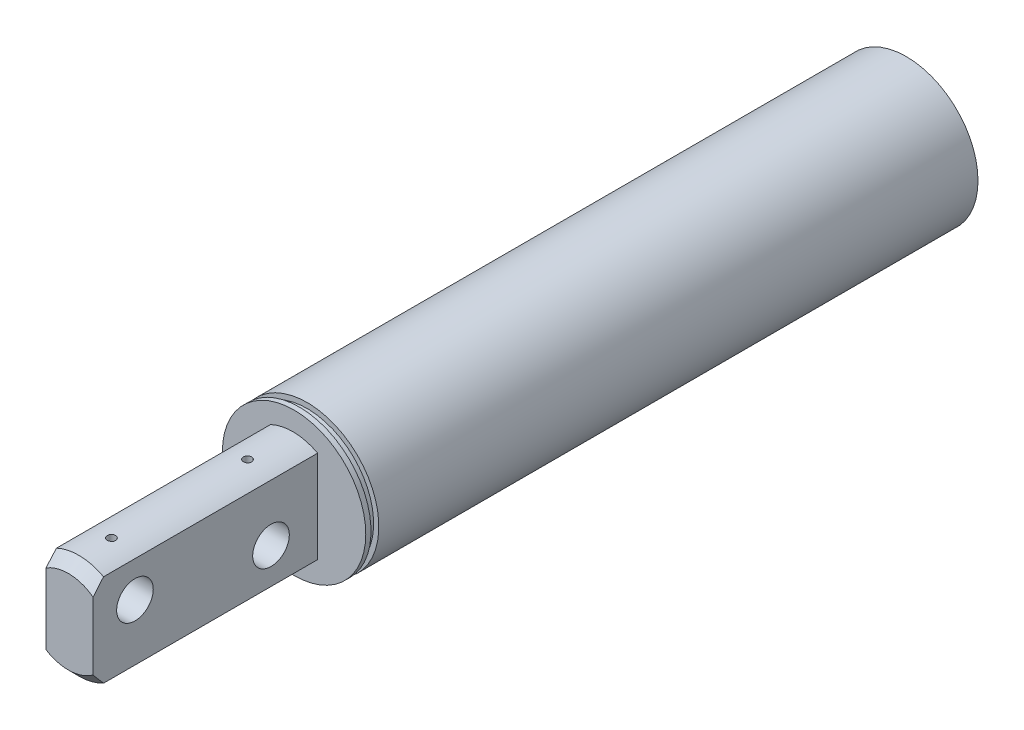
ISO-10303-21;
HEADER;
FILE_DESCRIPTION(('STEP AP214'),'2;1');
FILE_NAME('part.step','',(''),(''),'','','');
FILE_SCHEMA(('AUTOMOTIVE_DESIGN { 1 0 10303 214 1 1 1 1 }'));
ENDSEC;
DATA;
#1=APPLICATION_CONTEXT('core data for automotive mechanical design processes');
#2=APPLICATION_PROTOCOL_DEFINITION('international standard','automotive_design',2000,#1);
#3=PRODUCT_CONTEXT('',#1,'mechanical');
#4=PRODUCT('Part','Part','',(#3));
#5=PRODUCT_RELATED_PRODUCT_CATEGORY('part','',(#4));
#6=PRODUCT_DEFINITION_FORMATION('','',#4);
#7=PRODUCT_DEFINITION_CONTEXT('part definition',#1,'design');
#8=PRODUCT_DEFINITION('design','',#6,#7);
#9=PRODUCT_DEFINITION_SHAPE('','',#8);
#10=(LENGTH_UNIT() NAMED_UNIT(*) SI_UNIT(.MILLI.,.METRE.));
#11=(NAMED_UNIT(*) PLANE_ANGLE_UNIT() SI_UNIT($,.RADIAN.));
#12=(NAMED_UNIT(*) SI_UNIT($,.STERADIAN.) SOLID_ANGLE_UNIT());
#13=UNCERTAINTY_MEASURE_WITH_UNIT(LENGTH_MEASURE(1.E-05),#10,'distance_accuracy_value','');
#14=(GEOMETRIC_REPRESENTATION_CONTEXT(3) GLOBAL_UNCERTAINTY_ASSIGNED_CONTEXT((#13)) GLOBAL_UNIT_ASSIGNED_CONTEXT((#10,
#11,#12)) REPRESENTATION_CONTEXT('',''));
#15=CARTESIAN_POINT('',(0.,0.,0.));
#16=DIRECTION('',(0.,0.,1.));
#17=DIRECTION('',(1.,0.,0.));
#18=AXIS2_PLACEMENT_3D('',#15,#16,#17);
#19=CARTESIAN_POINT('',(4.50000000000002,-13.7,117.));
#20=DIRECTION('',(-1.,0.,0.));
#21=DIRECTION('',(0.,0.,1.));
#22=AXIS2_PLACEMENT_3D('',#19,#20,#21);
#23=PLANE('',#22);
#24=CARTESIAN_POINT('',(4.50000000000001,2.,151.91));
#25=DIRECTION('',(1.,0.,0.));
#26=DIRECTION('',(0.,0.,-1.));
#27=AXIS2_PLACEMENT_3D('',#24,#25,#26);
#28=CIRCLE('',#27,3.5);
#29=CARTESIAN_POINT('',(4.50000000000001,2.,148.41));
#30=VERTEX_POINT('',#29);
#31=EDGE_CURVE('E281',#30,#30,#28,.T.);
#32=ORIENTED_EDGE('',*,*,#31,.F.);
#33=EDGE_LOOP('',(#32));
#34=FACE_BOUND('',#33,.T.);
#35=DIRECTION('',(0.,-1.,0.));
#36=VECTOR('',#35,1.);
#37=CARTESIAN_POINT('',(4.50000000000002,0.,159.91));
#38=LINE('',#37,#36);
#39=CARTESIAN_POINT('',(4.50000000000002,6.45113074318509,159.91));
#40=VERTEX_POINT('',#39);
#41=CARTESIAN_POINT('',(4.50000000000002,-6.45113074318509,159.91));
#42=VERTEX_POINT('',#41);
#43=EDGE_CURVE('E149',#40,#42,#38,.T.);
#44=ORIENTED_EDGE('',*,*,#43,.T.);
#45=CARTESIAN_POINT('',(4.50000000000002,-6.45113074318509,159.91));
#46=CARTESIAN_POINT('',(4.50000000000002,-6.65176529630987,159.748168148892));
#47=CARTESIAN_POINT('',(4.50000000000002,-6.85114414426709,159.584794419696));
#48=CARTESIAN_POINT('',(4.50000000000002,-7.24774915667288,159.25549884287));
#49=CARTESIAN_POINT('',(4.50000000000002,-7.44497556784006,159.089577292639));
#50=CARTESIAN_POINT('',(4.50000000000002,-7.83767353685502,158.755690103172));
#51=CARTESIAN_POINT('',(4.50000000000002,-8.03314515885615,158.587724539197));
#52=CARTESIAN_POINT('',(4.50000000000002,-8.42263180392473,158.250066843062));
#53=CARTESIAN_POINT('',(4.50000000000002,-8.61664665624369,158.080374513833));
#54=CARTESIAN_POINT('',(4.50000000000002,-8.81005606484247,157.91));
#55=B_SPLINE_CURVE_WITH_KNOTS('',3,(#45,#46,#47,#48,#49,#50,#51,#52,#53,#54),.UNSPECIFIED.,.F.,
.F.,(4,2,2,2,4),(0.,0.773279599428819,1.54646961216985,2.31963124178719,3.0928821219833),.UNSPECIFIED.);
#56=CARTESIAN_POINT('',(4.50000000000002,-8.81005606484246,157.91));
#57=VERTEX_POINT('',#56);
#58=EDGE_CURVE('E103',#42,#57,#55,.T.);
#59=ORIENTED_EDGE('',*,*,#58,.T.);
#60=DIRECTION('',(0.,0.,-1.));
#61=VECTOR('',#60,1.);
#62=CARTESIAN_POINT('',(4.50000000000002,-8.81005606484246,159.91));
#63=LINE('',#62,#61);
#64=CARTESIAN_POINT('',(4.50000000000002,-8.81005606484246,117.));
#65=VERTEX_POINT('',#64);
#66=EDGE_CURVE('E96',#65,#57,#63,.F.);
#67=ORIENTED_EDGE('',*,*,#66,.F.);
#68=DIRECTION('',(0.,1.,0.));
#69=VECTOR('',#68,1.);
#70=CARTESIAN_POINT('',(4.50000000000002,-13.7,117.));
#71=LINE('',#70,#69);
#72=CARTESIAN_POINT('',(4.50000000000002,8.81005606484245,117.));
#73=VERTEX_POINT('',#72);
#74=EDGE_CURVE('E101',#65,#73,#71,.T.);
#75=ORIENTED_EDGE('',*,*,#74,.T.);
#76=DIRECTION('',(0.,0.,-1.));
#77=VECTOR('',#76,1.);
#78=CARTESIAN_POINT('',(4.50000000000002,8.81005606484246,159.91));
#79=LINE('',#78,#77);
#80=CARTESIAN_POINT('',(4.50000000000002,8.81005606484246,157.91));
#81=VERTEX_POINT('',#80);
#82=EDGE_CURVE('E105',#81,#73,#79,.T.);
#83=ORIENTED_EDGE('',*,*,#82,.F.);
#84=CARTESIAN_POINT('',(4.50000000000002,8.81005606484246,157.91));
#85=CARTESIAN_POINT('',(4.50000000000002,8.61664665624368,158.080374513833));
#86=CARTESIAN_POINT('',(4.50000000000002,8.42263180392473,158.250066843062));
#87=CARTESIAN_POINT('',(4.50000000000002,8.03314515885615,158.587724539197));
#88=CARTESIAN_POINT('',(4.50000000000002,7.83767353685502,158.755690103172));
#89=CARTESIAN_POINT('',(4.50000000000002,7.44497556784006,159.089577292639));
#90=CARTESIAN_POINT('',(4.50000000000002,7.24774915667288,159.25549884287));
#91=CARTESIAN_POINT('',(4.50000000000002,6.85114414426709,159.584794419696));
#92=CARTESIAN_POINT('',(4.50000000000002,6.65176529630987,159.748168148892));
#93=CARTESIAN_POINT('',(4.50000000000002,6.45113074318509,159.91));
#94=B_SPLINE_CURVE_WITH_KNOTS('',3,(#84,#85,#86,#87,#88,#89,#90,#91,#92,#93),.UNSPECIFIED.,.F.,
.F.,(4,2,2,2,4),(0.,0.7732508801961,1.54641250981345,2.31960252255447,3.09288212198329),.UNSPECIFIED.);
#95=EDGE_CURVE('E157',#81,#40,#94,.T.);
#96=ORIENTED_EDGE('',*,*,#95,.T.);
#97=EDGE_LOOP('',(#44,#59,#67,#75,#83,#96));
#98=FACE_BOUND('',#97,.T.);
#99=CARTESIAN_POINT('',(4.50000000000001,-2.,125.91));
#100=DIRECTION('',(1.,0.,0.));
#101=DIRECTION('',(0.,0.,-1.));
#102=AXIS2_PLACEMENT_3D('',#99,#100,#101);
#103=CIRCLE('',#102,3.5);
#104=CARTESIAN_POINT('',(4.50000000000001,-2.,122.41));
#105=VERTEX_POINT('',#104);
#106=EDGE_CURVE('E280',#105,#105,#103,.T.);
#107=ORIENTED_EDGE('',*,*,#106,.F.);
#108=EDGE_LOOP('',(#107));
#109=FACE_BOUND('',#108,.T.);
#110=ADVANCED_FACE('F39',(#34,#98,#109),#23,.F.);
#111=CARTESIAN_POINT('',(-0.231058246770208,0.,159.91));
#112=DIRECTION('',(0.,0.,-1.));
#113=DIRECTION('',(-1.,0.,0.));
#114=AXIS2_PLACEMENT_3D('',#111,#112,#113);
#115=CYLINDRICAL_SURFACE('',#114,10.);
#116=CARTESIAN_POINT('',(0.,9.99733024795117,152.71));
#117=CARTESIAN_POINT('',(-0.0448164715536945,9.99836562893752,152.709998050836));
#118=CARTESIAN_POINT('',(-0.0896703204818784,9.99909798231465,152.706221427345));
#119=CARTESIAN_POINT('',(-0.178151974911262,9.99995823984328,152.691204078089));
#120=CARTESIAN_POINT('',(-0.221778354426141,10.0000854676681,152.679955016641));
#121=CARTESIAN_POINT('',(-0.306510236579355,9.99980506337365,152.650313557471));
#122=CARTESIAN_POINT('',(-0.347616992368418,9.99939769943382,152.631924744681));
#123=CARTESIAN_POINT('',(-0.426155644513264,9.9981739143252,152.588530862024));
#124=CARTESIAN_POINT('',(-0.463588330052342,9.99735758123318,152.563527217295));
#125=CARTESIAN_POINT('',(-0.533782141540164,9.99547871547343,152.507573156618));
#126=CARTESIAN_POINT('',(-0.566537069957539,9.99441586099185,152.476614976602));
#127=CARTESIAN_POINT('',(-0.626394845115749,9.99222739950019,152.409646457573));
#128=CARTESIAN_POINT('',(-0.653497440523262,9.99110178970249,152.373635894023));
#129=CARTESIAN_POINT('',(-0.701327041514933,9.98896508848616,152.2975107614));
#130=CARTESIAN_POINT('',(-0.722042627860242,9.98795420419857,152.25738901062));
#131=CARTESIAN_POINT('',(-0.756443246484347,9.98620393285737,152.174231394013));
#132=CARTESIAN_POINT('',(-0.77012832966747,9.985464543838,152.131195549289));
#133=CARTESIAN_POINT('',(-0.79006983898021,9.98436812029285,152.043461574562));
#134=CARTESIAN_POINT('',(-0.796331282425991,9.9840108275408,151.998764588348));
#135=CARTESIAN_POINT('',(-0.801262431636428,9.98373044394861,151.908952712049));
#136=CARTESIAN_POINT('',(-0.799932215022949,9.98380734866897,151.863837826241));
#137=CARTESIAN_POINT('',(-0.789725210335578,9.98438364222183,151.774532679077));
#138=CARTESIAN_POINT('',(-0.78085825006169,9.98488248085475,151.730341290348));
#139=CARTESIAN_POINT('',(-0.755844398224968,9.98622826939893,151.644074855872));
#140=CARTESIAN_POINT('',(-0.739697453966788,9.98707522182996,151.601999825447));
#141=CARTESIAN_POINT('',(-0.700569648301163,9.98899099212294,151.521128109493));
#142=CARTESIAN_POINT('',(-0.677584195860258,9.99005995888822,151.482333648917));
#143=CARTESIAN_POINT('',(-0.625433968088085,9.99225433106744,151.409149434478));
#144=CARTESIAN_POINT('',(-0.596269132793446,9.99337973702897,151.374759723364));
#145=CARTESIAN_POINT('',(-0.532540249571987,9.99550518903139,151.311313743839));
#146=CARTESIAN_POINT('',(-0.497969054228726,9.9965050659174,151.282264648145));
#147=CARTESIAN_POINT('',(-0.424433965457316,9.99819764042164,151.230382044874));
#148=CARTESIAN_POINT('',(-0.385470102262505,9.9988903401539,151.207548494522));
#149=CARTESIAN_POINT('',(-0.304292417746331,9.99981405016584,151.168766059243));
#150=CARTESIAN_POINT('',(-0.262081550581156,10.0000454750767,151.152811001491));
#151=CARTESIAN_POINT('',(-0.175581705712701,9.99993957590488,151.128211781624));
#152=CARTESIAN_POINT('',(-0.131292763341597,9.99960226148873,151.119567495257));
#153=CARTESIAN_POINT('',(-0.0420003220856286,9.99831215603396,151.109844715213));
#154=CARTESIAN_POINT('',(0.00300138369068227,9.99736072523767,151.108749562979));
#155=CARTESIAN_POINT('',(0.0925364035772934,9.99486330569767,151.114105318003));
#156=CARTESIAN_POINT('',(0.137069717060089,9.99331731615754,151.120556235369));
#157=CARTESIAN_POINT('',(0.224424897259167,9.98971710667366,151.140815635757));
#158=CARTESIAN_POINT('',(0.267246139663399,9.98766270326358,151.15462677687));
#159=CARTESIAN_POINT('',(0.349958752369015,9.98319269521999,151.189209911956));
#160=CARTESIAN_POINT('',(0.389850053739594,9.98077708209259,151.209982069632));
#161=CARTESIAN_POINT('',(0.465719666473804,9.9757682871202,151.257982251316));
#162=CARTESIAN_POINT('',(0.501684050897747,9.9731745232473,151.285232228945));
#163=CARTESIAN_POINT('',(0.568532816421861,9.96803793919946,151.345383116326));
#164=CARTESIAN_POINT('',(0.599417117177957,9.96549511983081,151.378284115435));
#165=CARTESIAN_POINT('',(0.655287998303779,9.96068172307531,151.448884035577));
#166=CARTESIAN_POINT('',(0.680263118984272,9.95841167880818,151.486592064581));
#167=CARTESIAN_POINT('',(0.723522226784302,9.95435835271594,151.565692686769));
#168=CARTESIAN_POINT('',(0.741806347195717,9.95257506119437,151.607085206533));
#169=CARTESIAN_POINT('',(0.77110816651475,9.94966733792224,151.692252050304));
#170=CARTESIAN_POINT('',(0.782147205774453,9.94854097230101,151.736018964461));
#171=CARTESIAN_POINT('',(0.796720658346295,9.94704604732438,151.824797186399));
#172=CARTESIAN_POINT('',(0.800255288168279,9.94667746610615,151.869808458241));
#173=CARTESIAN_POINT('',(0.799717165124119,9.94673323132537,151.959582418789));
#174=CARTESIAN_POINT('',(0.795678429355267,9.9471540321186,152.004345317611));
#175=CARTESIAN_POINT('',(0.780179198844884,9.94874156175099,152.092553103553));
#176=CARTESIAN_POINT('',(0.768718705483159,9.94990829045147,152.135997990918));
#177=CARTESIAN_POINT('',(0.73871056256466,9.95287768270505,152.220338658801));
#178=CARTESIAN_POINT('',(0.720163500451599,9.95468029354552,152.261234650284));
#179=CARTESIAN_POINT('',(0.676514107827381,9.95875448025136,152.339336716429));
#180=CARTESIAN_POINT('',(0.651411835870026,9.96102605192776,152.376542824046));
#181=CARTESIAN_POINT('',(0.595239162991805,9.96584308631011,152.446383556451));
#182=CARTESIAN_POINT('',(0.564143538246483,9.96838968585205,152.478997814653));
#183=CARTESIAN_POINT('',(0.496919275791163,9.97352408378836,152.53856041135));
#184=CARTESIAN_POINT('',(0.460789364750812,9.97611189245868,152.565507312051));
#185=CARTESIAN_POINT('',(0.384381369612836,9.98111737703336,152.613053125072));
#186=CARTESIAN_POINT('',(0.344088872875533,9.98353440947177,152.633628923789));
#187=CARTESIAN_POINT('',(0.260629107895079,9.9879919273232,152.667693516252));
#188=CARTESIAN_POINT('',(0.217465197873013,9.99003284243712,152.681190430346));
#189=CARTESIAN_POINT('',(0.145040380452117,9.99296579572233,152.697283238683));
#190=CARTESIAN_POINT('',(0.116248557898315,9.99400910218454,152.702045209457));
#191=CARTESIAN_POINT('',(0.0583097653650458,9.99585445857249,152.708404221295));
#192=CARTESIAN_POINT('',(0.0291627960584129,9.9966565089552,152.710001268352));
#193=CARTESIAN_POINT('',(0.,9.99733024795117,152.71));
#194=B_SPLINE_CURVE_WITH_KNOTS('',3,(#116,#117,#118,#119,#120,#121,#122,#123,#124,#125,#126,
#127,#128,#129,#130,#131,#132,#133,#134,#135,#136,#137,#138,#139,#140,#141,#142,#143,#144,#145,
#146,#147,#148,#149,#150,#151,#152,#153,#154,#155,#156,#157,#158,#159,#160,#161,#162,#163,#164,
#165,#166,#167,#168,#169,#170,#171,#172,#173,#174,#175,#176,#177,#178,#179,#180,#181,#182,#183,
#184,#185,#186,#187,#188,#189,#190,#191,#192,#193),.UNSPECIFIED.,.T.,.F.,(4,2,2,2,2,2,2,2,2,2,2,
2,2,2,2,2,2,2,2,2,2,2,2,2,2,2,2,2,2,2,2,2,2,2,2,2,2,2,4),(0.,0.134379004257788,
0.268908163782449,0.40336986219576,0.537802614993683,0.672411856599892,0.807027082386088,
0.941881607476008,1.07673515613858,1.21149751108595,1.34625848814145,1.48084400802955,
1.61543050211544,1.75010755553852,1.88478591589796,2.01964385537322,2.15450086672074,
2.28923660289678,2.42397004907739,2.55840608560381,2.6928423022111,2.82732710242435,
2.96181506556066,3.09676548089237,3.2317180303275,3.366930186937,3.50213964982914,
3.63694904490567,3.77175455054118,3.9059560035859,4.04015743168073,4.17434773751173,
4.30853684474129,4.44330354860052,4.57810440131019,4.71338871573263,4.84851750119824,
4.93596023783251,5.02340280883025),.UNSPECIFIED.);
#195=CARTESIAN_POINT('',(0.,9.99733024795117,152.71));
#196=VERTEX_POINT('',#195);
#197=EDGE_CURVE('E238',#196,#196,#194,.T.);
#198=ORIENTED_EDGE('',*,*,#197,.T.);
#199=EDGE_LOOP('',(#198));
#200=FACE_BOUND('',#199,.T.);
#201=CARTESIAN_POINT('',(0.,9.99733024795117,126.71));
#202=CARTESIAN_POINT('',(-0.0448164715536931,9.99836562893752,126.709998050836));
#203=CARTESIAN_POINT('',(-0.0896703204818753,9.99909798231465,126.706221427345));
#204=CARTESIAN_POINT('',(-0.178151974911259,9.99995823984328,126.691204078089));
#205=CARTESIAN_POINT('',(-0.22177835442614,10.0000854676681,126.679955016641));
#206=CARTESIAN_POINT('',(-0.306510236579356,9.99980506337365,126.650313557471));
#207=CARTESIAN_POINT('',(-0.347616992368418,9.99939769943382,126.631924744681));
#208=CARTESIAN_POINT('',(-0.426155644513264,9.9981739143252,126.588530862024));
#209=CARTESIAN_POINT('',(-0.463588330052341,9.99735758123318,126.563527217295));
#210=CARTESIAN_POINT('',(-0.533782141540159,9.99547871547343,126.507573156618));
#211=CARTESIAN_POINT('',(-0.566537069957532,9.99441586099185,126.476614976602));
#212=CARTESIAN_POINT('',(-0.626394845115743,9.99222739950019,126.409646457573));
#213=CARTESIAN_POINT('',(-0.653497440523256,9.99110178970249,126.373635894023));
#214=CARTESIAN_POINT('',(-0.701327041514934,9.98896508848616,126.2975107614));
#215=CARTESIAN_POINT('',(-0.722042627860252,9.98795420419857,126.25738901062));
#216=CARTESIAN_POINT('',(-0.756443246484357,9.98620393285737,126.174231394013));
#217=CARTESIAN_POINT('',(-0.770128329667472,9.985464543838,126.131195549289));
#218=CARTESIAN_POINT('',(-0.790069838980208,9.98436812029285,126.043461574562));
#219=CARTESIAN_POINT('',(-0.796331282425991,9.9840108275408,125.998764588348));
#220=CARTESIAN_POINT('',(-0.801262431636429,9.98373044394861,125.908952712049));
#221=CARTESIAN_POINT('',(-0.79993221502295,9.98380734866897,125.863837826241));
#222=CARTESIAN_POINT('',(-0.789725210335579,9.98438364222183,125.774532679077));
#223=CARTESIAN_POINT('',(-0.780858250061691,9.98488248085475,125.730341290348));
#224=CARTESIAN_POINT('',(-0.755844398224968,9.98622826939893,125.644074855872));
#225=CARTESIAN_POINT('',(-0.739697453966789,9.98707522182996,125.601999825447));
#226=CARTESIAN_POINT('',(-0.700569648301164,9.98899099212294,125.521128109493));
#227=CARTESIAN_POINT('',(-0.677584195860258,9.99005995888822,125.482333648917));
#228=CARTESIAN_POINT('',(-0.625433968088085,9.99225433106744,125.409149434478));
#229=CARTESIAN_POINT('',(-0.596269132793445,9.99337973702897,125.374759723364));
#230=CARTESIAN_POINT('',(-0.532540249571991,9.99550518903139,125.311313743839));
#231=CARTESIAN_POINT('',(-0.497969054228737,9.9965050659174,125.282264648145));
#232=CARTESIAN_POINT('',(-0.424433965457327,9.99819764042164,125.230382044874));
#233=CARTESIAN_POINT('',(-0.385470102262511,9.9988903401539,125.207548494522));
#234=CARTESIAN_POINT('',(-0.304292417746328,9.99981405016584,125.168766059243));
#235=CARTESIAN_POINT('',(-0.262081550581151,10.0000454750767,125.152811001491));
#236=CARTESIAN_POINT('',(-0.175581705712697,9.99993957590488,125.128211781624));
#237=CARTESIAN_POINT('',(-0.131292763341595,9.99960226148873,125.119567495257));
#238=CARTESIAN_POINT('',(-0.0420003220856294,9.99831215603396,125.109844715213));
#239=CARTESIAN_POINT('',(0.00300138369068098,9.99736072523767,125.108749562979));
#240=CARTESIAN_POINT('',(0.0925364035772923,9.99486330569767,125.114105318003));
#241=CARTESIAN_POINT('',(0.137069717060089,9.99331731615754,125.120556235369));
#242=CARTESIAN_POINT('',(0.224424897259167,9.98971710667366,125.140815635757));
#243=CARTESIAN_POINT('',(0.267246139663399,9.98766270326358,125.15462677687));
#244=CARTESIAN_POINT('',(0.349958752369015,9.98319269521999,125.189209911956));
#245=CARTESIAN_POINT('',(0.389850053739596,9.98077708209259,125.209982069632));
#246=CARTESIAN_POINT('',(0.4657196664738,9.9757682871202,125.257982251316));
#247=CARTESIAN_POINT('',(0.501684050897736,9.9731745232473,125.285232228945));
#248=CARTESIAN_POINT('',(0.56853281642185,9.96803793919946,125.345383116326));
#249=CARTESIAN_POINT('',(0.599417117177953,9.96549511983081,125.378284115435));
#250=CARTESIAN_POINT('',(0.655287998303775,9.96068172307531,125.448884035577));
#251=CARTESIAN_POINT('',(0.680263118984264,9.95841167880818,125.486592064581));
#252=CARTESIAN_POINT('',(0.723522226784296,9.95435835271594,125.565692686769));
#253=CARTESIAN_POINT('',(0.741806347195714,9.95257506119437,125.607085206533));
#254=CARTESIAN_POINT('',(0.771108166514753,9.94966733792224,125.692252050304));
#255=CARTESIAN_POINT('',(0.782147205774459,9.948540972301,125.736018964461));
#256=CARTESIAN_POINT('',(0.796720658346297,9.94704604732438,125.824797186399));
#257=CARTESIAN_POINT('',(0.800255288168278,9.94667746610615,125.869808458241));
#258=CARTESIAN_POINT('',(0.79971716512412,9.94673323132537,125.959582418789));
#259=CARTESIAN_POINT('',(0.795678429355272,9.9471540321186,126.004345317611));
#260=CARTESIAN_POINT('',(0.780179198844889,9.94874156175099,126.092553103553));
#261=CARTESIAN_POINT('',(0.76871870548316,9.94990829045147,126.135997990918));
#262=CARTESIAN_POINT('',(0.73871056256466,9.95287768270505,126.220338658801));
#263=CARTESIAN_POINT('',(0.7201635004516,9.95468029354552,126.261234650284));
#264=CARTESIAN_POINT('',(0.676514107827381,9.95875448025136,126.339336716429));
#265=CARTESIAN_POINT('',(0.651411835870024,9.96102605192776,126.376542824046));
#266=CARTESIAN_POINT('',(0.595239162991801,9.96584308631011,126.446383556451));
#267=CARTESIAN_POINT('',(0.564143538246478,9.96838968585205,126.478997814653));
#268=CARTESIAN_POINT('',(0.496919275791156,9.97352408378836,126.53856041135));
#269=CARTESIAN_POINT('',(0.460789364750806,9.97611189245868,126.565507312051));
#270=CARTESIAN_POINT('',(0.384381369612838,9.98111737703336,126.613053125072));
#271=CARTESIAN_POINT('',(0.344088872875541,9.98353440947177,126.633628923789));
#272=CARTESIAN_POINT('',(0.260629107895088,9.9879919273232,126.667693516252));
#273=CARTESIAN_POINT('',(0.217465197873017,9.99003284243712,126.681190430346));
#274=CARTESIAN_POINT('',(0.145040380452119,9.99296579572233,126.697283238683));
#275=CARTESIAN_POINT('',(0.116248557898317,9.99400910218454,126.702045209457));
#276=CARTESIAN_POINT('',(0.0583097653650484,9.99585445857249,126.708404221295));
#277=CARTESIAN_POINT('',(0.0291627960584143,9.9966565089552,126.710001268352));
#278=CARTESIAN_POINT('',(0.,9.99733024795117,126.71));
#279=B_SPLINE_CURVE_WITH_KNOTS('',3,(#201,#202,#203,#204,#205,#206,#207,#208,#209,#210,#211,
#212,#213,#214,#215,#216,#217,#218,#219,#220,#221,#222,#223,#224,#225,#226,#227,#228,#229,#230,
#231,#232,#233,#234,#235,#236,#237,#238,#239,#240,#241,#242,#243,#244,#245,#246,#247,#248,#249,
#250,#251,#252,#253,#254,#255,#256,#257,#258,#259,#260,#261,#262,#263,#264,#265,#266,#267,#268,
#269,#270,#271,#272,#273,#274,#275,#276,#277,#278),.UNSPECIFIED.,.T.,.F.,(4,2,2,2,2,2,2,2,2,2,2,
2,2,2,2,2,2,2,2,2,2,2,2,2,2,2,2,2,2,2,2,2,2,2,2,2,2,2,4),(0.,0.134379004257783,
0.268908163782449,0.40336986219576,0.537802614993683,0.672411856599864,0.807027082386089,
0.941881607476014,1.07673515613859,1.21149751108596,1.34625848814145,1.48084400802955,
1.61543050211544,1.75010755553853,1.88478591589796,2.01964385537322,2.15450086672074,
2.28923660289679,2.4239700490774,2.55840608560381,2.6928423022111,2.82732710242436,
2.96181506556067,3.09676548089236,3.23171803032751,3.36693018693697,3.50213964982915,
3.6369490449057,3.77175455054118,3.9059560035859,4.04015743168073,4.17434773751173,
4.30853684474129,4.44330354860056,4.57810440131019,4.71338871573263,4.84851750119824,
4.93596023783251,5.02340280883026),.UNSPECIFIED.);
#280=CARTESIAN_POINT('',(0.,9.99733024795117,126.71));
#281=VERTEX_POINT('',#280);
#282=EDGE_CURVE('E231',#281,#281,#279,.T.);
#283=ORIENTED_EDGE('',*,*,#282,.T.);
#284=EDGE_LOOP('',(#283));
#285=FACE_BOUND('',#284,.T.);
#286=DIRECTION('',(0.,0.,-1.));
#287=VECTOR('',#286,1.);
#288=CARTESIAN_POINT('',(-4.49999999999998,9.04301588561756,159.91));
#289=LINE('',#288,#287);
#290=CARTESIAN_POINT('',(-4.49999999999999,9.04301588561755,117.));
#291=VERTEX_POINT('',#290);
#292=CARTESIAN_POINT('',(-4.49999999999998,9.04301588561756,157.91));
#293=VERTEX_POINT('',#292);
#294=EDGE_CURVE('E291',#291,#293,#289,.F.);
#295=ORIENTED_EDGE('',*,*,#294,.T.);
#296=CARTESIAN_POINT('',(-0.231058246770208,0.,157.91));
#297=DIRECTION('',(0.,0.,1.));
#298=DIRECTION('',(1.,0.,0.));
#299=AXIS2_PLACEMENT_3D('',#296,#297,#298);
#300=CIRCLE('',#299,10.);
#301=EDGE_CURVE('E11',#293,#81,#300,.F.);
#302=ORIENTED_EDGE('',*,*,#301,.T.);
#303=ORIENTED_EDGE('',*,*,#82,.T.);
#304=CARTESIAN_POINT('',(-0.231058246770208,0.,117.));
#305=DIRECTION('',(0.,0.,1.));
#306=DIRECTION('',(1.,0.,0.));
#307=AXIS2_PLACEMENT_3D('',#304,#305,#306);
#308=CIRCLE('',#307,10.);
#309=EDGE_CURVE('E113',#73,#291,#308,.T.);
#310=ORIENTED_EDGE('',*,*,#309,.T.);
#311=EDGE_LOOP('',(#295,#302,#303,#310));
#312=FACE_BOUND('',#311,.T.);
#313=ADVANCED_FACE('F171',(#200,#285,#312),#115,.T.);
#314=CARTESIAN_POINT('',(0.,0.,117.));
#315=DIRECTION('',(0.,0.,1.));
#316=DIRECTION('',(1.,0.,0.));
#317=AXIS2_PLACEMENT_3D('',#314,#315,#316);
#318=PLANE('',#317);
#319=ORIENTED_EDGE('',*,*,#309,.F.);
#320=ORIENTED_EDGE('',*,*,#74,.F.);
#321=CARTESIAN_POINT('',(-4.49999999999999,-9.04301588561756,117.));
#322=VERTEX_POINT('',#321);
#323=EDGE_CURVE('E112',#322,#65,#308,.T.);
#324=ORIENTED_EDGE('',*,*,#323,.F.);
#325=DIRECTION('',(0.,1.,0.));
#326=VECTOR('',#325,1.);
#327=CARTESIAN_POINT('',(-4.49999999999999,-13.7,117.));
#328=LINE('',#327,#326);
#329=EDGE_CURVE('E290',#322,#291,#328,.T.);
#330=ORIENTED_EDGE('',*,*,#329,.T.);
#331=EDGE_LOOP('',(#319,#320,#324,#330));
#332=FACE_BOUND('',#331,.T.);
#333=CARTESIAN_POINT('',(0.,0.,117.));
#334=DIRECTION('',(0.,0.,1.));
#335=DIRECTION('',(1.,0.,0.));
#336=AXIS2_PLACEMENT_3D('',#333,#334,#335);
#337=CIRCLE('',#336,13.7);
#338=CARTESIAN_POINT('',(13.7,0.,117.));
#339=VERTEX_POINT('',#338);
#340=EDGE_CURVE('E142',#339,#339,#337,.T.);
#341=ORIENTED_EDGE('',*,*,#340,.T.);
#342=EDGE_LOOP('',(#341));
#343=FACE_BOUND('',#342,.T.);
#344=ADVANCED_FACE('F109',(#332,#343),#318,.T.);
#345=CARTESIAN_POINT('',(0.,0.,117.));
#346=DIRECTION('',(0.,0.,-1.));
#347=DIRECTION('',(-1.,0.,0.));
#348=AXIS2_PLACEMENT_3D('',#345,#346,#347);
#349=CYLINDRICAL_SURFACE('',#348,13.7);
#350=CARTESIAN_POINT('',(0.,0.,114.5));
#351=DIRECTION('',(0.,0.,-1.));
#352=DIRECTION('',(-1.,0.,0.));
#353=AXIS2_PLACEMENT_3D('',#350,#351,#352);
#354=CIRCLE('',#353,13.7);
#355=CARTESIAN_POINT('',(-13.7,0.,114.5));
#356=VERTEX_POINT('',#355);
#357=EDGE_CURVE('E138',#356,#356,#354,.T.);
#358=ORIENTED_EDGE('',*,*,#357,.T.);
#359=EDGE_LOOP('',(#358));
#360=FACE_BOUND('',#359,.T.);
#361=CARTESIAN_POINT('',(0.,0.,0.));
#362=DIRECTION('',(0.,0.,1.));
#363=DIRECTION('',(1.,0.,0.));
#364=AXIS2_PLACEMENT_3D('',#361,#362,#363);
#365=CIRCLE('',#364,13.7);
#366=CARTESIAN_POINT('',(13.7,0.,0.));
#367=VERTEX_POINT('',#366);
#368=EDGE_CURVE('E141',#367,#367,#365,.T.);
#369=ORIENTED_EDGE('',*,*,#368,.T.);
#370=EDGE_LOOP('',(#369));
#371=FACE_BOUND('',#370,.T.);
#372=ADVANCED_FACE('F203',(#360,#371),#349,.T.);
#373=CARTESIAN_POINT('',(0.,0.,0.));
#374=DIRECTION('',(0.,0.,1.));
#375=DIRECTION('',(1.,0.,0.));
#376=AXIS2_PLACEMENT_3D('',#373,#374,#375);
#377=PLANE('',#376);
#378=CARTESIAN_POINT('',(0.,0.,0.));
#379=DIRECTION('',(0.,0.,-1.));
#380=DIRECTION('',(-1.,0.,0.));
#381=AXIS2_PLACEMENT_3D('',#378,#379,#380);
#382=CIRCLE('',#381,5.09999999999999);
#383=CARTESIAN_POINT('',(-5.09999999999999,0.,0.));
#384=VERTEX_POINT('',#383);
#385=EDGE_CURVE('E119',#384,#384,#382,.T.);
#386=ORIENTED_EDGE('',*,*,#385,.F.);
#387=EDGE_LOOP('',(#386));
#388=FACE_BOUND('',#387,.T.);
#389=ORIENTED_EDGE('',*,*,#368,.F.);
#390=EDGE_LOOP('',(#389));
#391=FACE_BOUND('',#390,.T.);
#392=ADVANCED_FACE('F204',(#388,#391),#377,.F.);
#393=CARTESIAN_POINT('',(-13.7,0.,114.5));
#394=DIRECTION('',(0.,0.,-1.));
#395=DIRECTION('',(-1.,0.,0.));
#396=AXIS2_PLACEMENT_3D('',#393,#394,#395);
#397=PLANE('',#396);
#398=ORIENTED_EDGE('',*,*,#357,.F.);
#399=EDGE_LOOP('',(#398));
#400=FACE_BOUND('',#399,.T.);
#401=CARTESIAN_POINT('',(0.,0.,114.5));
#402=DIRECTION('',(0.,0.,-1.));
#403=DIRECTION('',(-1.,0.,0.));
#404=AXIS2_PLACEMENT_3D('',#401,#402,#403);
#405=CIRCLE('',#404,12.7);
#406=CARTESIAN_POINT('',(-12.7,0.,114.5));
#407=VERTEX_POINT('',#406);
#408=EDGE_CURVE('E135',#407,#407,#405,.T.);
#409=ORIENTED_EDGE('',*,*,#408,.T.);
#410=EDGE_LOOP('',(#409));
#411=FACE_BOUND('',#410,.T.);
#412=ADVANCED_FACE('F207',(#400,#411),#397,.F.);
#413=CARTESIAN_POINT('',(0.,0.,0.));
#414=DIRECTION('',(0.,0.,-1.));
#415=DIRECTION('',(-1.,0.,0.));
#416=AXIS2_PLACEMENT_3D('',#413,#414,#415);
#417=CYLINDRICAL_SURFACE('',#416,12.7);
#418=ORIENTED_EDGE('',*,*,#408,.F.);
#419=EDGE_LOOP('',(#418));
#420=FACE_BOUND('',#419,.T.);
#421=CARTESIAN_POINT('',(0.,0.,116.));
#422=DIRECTION('',(0.,0.,-1.));
#423=DIRECTION('',(-1.,0.,0.));
#424=AXIS2_PLACEMENT_3D('',#421,#422,#423);
#425=CIRCLE('',#424,12.7);
#426=CARTESIAN_POINT('',(-12.7,0.,116.));
#427=VERTEX_POINT('',#426);
#428=EDGE_CURVE('E132',#427,#427,#425,.T.);
#429=ORIENTED_EDGE('',*,*,#428,.T.);
#430=EDGE_LOOP('',(#429));
#431=FACE_BOUND('',#430,.T.);
#432=ADVANCED_FACE('F213',(#420,#431),#417,.T.);
#433=CARTESIAN_POINT('',(-13.7,0.,116.));
#434=DIRECTION('',(0.,0.,1.));
#435=DIRECTION('',(1.,0.,0.));
#436=AXIS2_PLACEMENT_3D('',#433,#434,#435);
#437=PLANE('',#436);
#438=ORIENTED_EDGE('',*,*,#428,.F.);
#439=EDGE_LOOP('',(#438));
#440=FACE_BOUND('',#439,.T.);
#441=CARTESIAN_POINT('',(0.,0.,116.));
#442=DIRECTION('',(0.,0.,-1.));
#443=DIRECTION('',(-1.,0.,0.));
#444=AXIS2_PLACEMENT_3D('',#441,#442,#443);
#445=CIRCLE('',#444,13.7);
#446=CARTESIAN_POINT('',(-13.7,0.,116.));
#447=VERTEX_POINT('',#446);
#448=EDGE_CURVE('E129',#447,#447,#445,.T.);
#449=ORIENTED_EDGE('',*,*,#448,.T.);
#450=EDGE_LOOP('',(#449));
#451=FACE_BOUND('',#450,.T.);
#452=ADVANCED_FACE('F201',(#440,#451),#437,.F.);
#453=ORIENTED_EDGE('',*,*,#448,.F.);
#454=EDGE_LOOP('',(#453));
#455=FACE_BOUND('',#454,.T.);
#456=ORIENTED_EDGE('',*,*,#340,.F.);
#457=EDGE_LOOP('',(#456));
#458=FACE_BOUND('',#457,.T.);
#459=ADVANCED_FACE('F196',(#455,#458),#349,.T.);
#460=CARTESIAN_POINT('',(0.,0.,82.25));
#461=DIRECTION('',(0.,0.,-1.));
#462=DIRECTION('',(-1.,0.,0.));
#463=AXIS2_PLACEMENT_3D('',#460,#461,#462);
#464=CONICAL_SURFACE('',#463,5.09999999999998,1.02974425867665);
#465=CARTESIAN_POINT('',(0.,0.,85.3143891570406));
#466=VERTEX_POINT('',#465);
#467=VERTEX_LOOP('',#466);
#468=FACE_BOUND('',#467,.T.);
#469=CARTESIAN_POINT('',(0.,0.,82.25));
#470=DIRECTION('',(0.,0.,-1.));
#471=DIRECTION('',(-1.,0.,0.));
#472=AXIS2_PLACEMENT_3D('',#469,#470,#471);
#473=CIRCLE('',#472,5.09999999999998);
#474=CARTESIAN_POINT('',(-5.09999999999998,0.,82.25));
#475=VERTEX_POINT('',#474);
#476=EDGE_CURVE('E122',#475,#475,#473,.T.);
#477=ORIENTED_EDGE('',*,*,#476,.T.);
#478=EDGE_LOOP('',(#477));
#479=FACE_BOUND('',#478,.T.);
#480=ADVANCED_FACE('F200',(#468,#479),#464,.F.);
#481=CARTESIAN_POINT('',(0.,0.,0.));
#482=DIRECTION('',(0.,0.,-1.));
#483=DIRECTION('',(-1.,0.,0.));
#484=AXIS2_PLACEMENT_3D('',#481,#482,#483);
#485=CYLINDRICAL_SURFACE('',#484,5.09999999999998);
#486=ORIENTED_EDGE('',*,*,#476,.F.);
#487=EDGE_LOOP('',(#486));
#488=FACE_BOUND('',#487,.T.);
#489=ORIENTED_EDGE('',*,*,#385,.T.);
#490=EDGE_LOOP('',(#489));
#491=FACE_BOUND('',#490,.T.);
#492=ADVANCED_FACE('F223',(#488,#491),#485,.F.);
#493=ORIENTED_EDGE('',*,*,#66,.T.);
#494=CARTESIAN_POINT('',(-0.231058246770208,0.,157.91));
#495=DIRECTION('',(0.,0.,1.));
#496=DIRECTION('',(1.,0.,0.));
#497=AXIS2_PLACEMENT_3D('',#494,#495,#496);
#498=CIRCLE('',#497,10.);
#499=CARTESIAN_POINT('',(-4.49999999999998,-9.04301588561756,157.91));
#500=VERTEX_POINT('',#499);
#501=EDGE_CURVE('E63',#57,#500,#498,.F.);
#502=ORIENTED_EDGE('',*,*,#501,.T.);
#503=DIRECTION('',(0.,0.,-1.));
#504=VECTOR('',#503,1.);
#505=CARTESIAN_POINT('',(-4.49999999999998,-9.04301588561756,159.91));
#506=LINE('',#505,#504);
#507=EDGE_CURVE('E117',#500,#322,#506,.T.);
#508=ORIENTED_EDGE('',*,*,#507,.T.);
#509=ORIENTED_EDGE('',*,*,#323,.T.);
#510=EDGE_LOOP('',(#493,#502,#508,#509));
#511=FACE_BOUND('',#510,.T.);
#512=ADVANCED_FACE('F116',(#511),#115,.T.);
#513=CARTESIAN_POINT('',(-0.231058246770208,0.,159.91));
#514=DIRECTION('',(0.,0.,1.));
#515=DIRECTION('',(1.,0.,0.));
#516=AXIS2_PLACEMENT_3D('',#513,#514,#515);
#517=PLANE('',#516);
#518=DIRECTION('',(0.,1.,0.));
#519=VECTOR('',#518,1.);
#520=CARTESIAN_POINT('',(-4.49999999999998,0.,159.91));
#521=LINE('',#520,#519);
#522=CARTESIAN_POINT('',(-4.49999999999998,-6.76580640482211,159.91));
#523=VERTEX_POINT('',#522);
#524=CARTESIAN_POINT('',(-4.49999999999998,6.76580640482211,159.91));
#525=VERTEX_POINT('',#524);
#526=EDGE_CURVE('E145',#523,#525,#521,.T.);
#527=ORIENTED_EDGE('',*,*,#526,.F.);
#528=CARTESIAN_POINT('',(-0.231058246770208,0.,159.91));
#529=DIRECTION('',(0.,0.,1.));
#530=DIRECTION('',(1.,0.,0.));
#531=AXIS2_PLACEMENT_3D('',#528,#529,#530);
#532=CIRCLE('',#531,8.00000000000002);
#533=EDGE_CURVE('E154',#523,#42,#532,.T.);
#534=ORIENTED_EDGE('',*,*,#533,.T.);
#535=ORIENTED_EDGE('',*,*,#43,.F.);
#536=CARTESIAN_POINT('',(-0.231058246770208,0.,159.91));
#537=DIRECTION('',(0.,0.,1.));
#538=DIRECTION('',(1.,0.,0.));
#539=AXIS2_PLACEMENT_3D('',#536,#537,#538);
#540=CIRCLE('',#539,8.00000000000002);
#541=EDGE_CURVE('E151',#40,#525,#540,.T.);
#542=ORIENTED_EDGE('',*,*,#541,.T.);
#543=EDGE_LOOP('',(#527,#534,#535,#542));
#544=FACE_BOUND('',#543,.T.);
#545=ADVANCED_FACE('F181',(#544),#517,.T.);
#546=CARTESIAN_POINT('',(-4.49999999999999,-13.7,117.));
#547=DIRECTION('',(1.,0.,0.));
#548=DIRECTION('',(0.,0.,-1.));
#549=AXIS2_PLACEMENT_3D('',#546,#547,#548);
#550=PLANE('',#549);
#551=CARTESIAN_POINT('',(-4.49999999999998,-2.,125.91));
#552=DIRECTION('',(1.,0.,0.));
#553=DIRECTION('',(0.,0.,-1.));
#554=AXIS2_PLACEMENT_3D('',#551,#552,#553);
#555=CIRCLE('',#554,3.5);
#556=CARTESIAN_POINT('',(-4.49999999999998,-2.,122.41));
#557=VERTEX_POINT('',#556);
#558=EDGE_CURVE('E277',#557,#557,#555,.T.);
#559=ORIENTED_EDGE('',*,*,#558,.T.);
#560=EDGE_LOOP('',(#559));
#561=FACE_BOUND('',#560,.T.);
#562=CARTESIAN_POINT('',(-4.49999999999998,2.,151.91));
#563=DIRECTION('',(1.,0.,0.));
#564=DIRECTION('',(0.,0.,-1.));
#565=AXIS2_PLACEMENT_3D('',#562,#563,#564);
#566=CIRCLE('',#565,3.5);
#567=CARTESIAN_POINT('',(-4.49999999999998,2.,148.41));
#568=VERTEX_POINT('',#567);
#569=EDGE_CURVE('E114',#568,#568,#566,.T.);
#570=ORIENTED_EDGE('',*,*,#569,.T.);
#571=EDGE_LOOP('',(#570));
#572=FACE_BOUND('',#571,.T.);
#573=ORIENTED_EDGE('',*,*,#507,.F.);
#574=CARTESIAN_POINT('',(-4.49999999999998,-9.04301588561756,157.91));
#575=CARTESIAN_POINT('',(-4.49999999999998,-8.85566741923907,158.079404911765));
#576=CARTESIAN_POINT('',(-4.49999999999998,-8.66785470642748,158.248299236807));
#577=CARTESIAN_POINT('',(-4.49999999999998,-8.29111163717534,158.584810701303));
#578=CARTESIAN_POINT('',(-4.49999999999998,-8.10218135641634,158.752427925522));
#579=CARTESIAN_POINT('',(-4.49999999999998,-7.72298496362379,159.086155449924));
#580=CARTESIAN_POINT('',(-4.49999999999998,-7.53271882348791,159.252265718236));
#581=CARTESIAN_POINT('',(-4.49999999999998,-7.15055497161566,159.582623621872));
#582=CARTESIAN_POINT('',(-4.49999999999998,-6.95865715109862,159.746871131279));
#583=CARTESIAN_POINT('',(-4.49999999999998,-6.7658064048221,159.91));
#584=B_SPLINE_CURVE_WITH_KNOTS('',3,(#574,#575,#576,#577,#578,#579,#580,#581,#582,#583),
.UNSPECIFIED.,.F.,.F.,(4,2,2,2,4),(0.,0.757746575150531,1.5154424102304,2.27315423292522,
3.03091697303169),.UNSPECIFIED.);
#585=EDGE_CURVE('E48',#500,#523,#584,.T.);
#586=ORIENTED_EDGE('',*,*,#585,.T.);
#587=ORIENTED_EDGE('',*,*,#526,.T.);
#588=CARTESIAN_POINT('',(-4.49999999999998,6.76580640482211,159.91));
#589=CARTESIAN_POINT('',(-4.49999999999998,6.95865715109861,159.746871131279));
#590=CARTESIAN_POINT('',(-4.49999999999998,7.15055497161564,159.582623621872));
#591=CARTESIAN_POINT('',(-4.49999999999998,7.5327188234879,159.252265718236));
#592=CARTESIAN_POINT('',(-4.49999999999998,7.72298496362378,159.086155449924));
#593=CARTESIAN_POINT('',(-4.49999999999998,8.10218135641634,158.752427925522));
#594=CARTESIAN_POINT('',(-4.49999999999998,8.29111163717534,158.584810701303));
#595=CARTESIAN_POINT('',(-4.49999999999998,8.66785470642748,158.248299236807));
#596=CARTESIAN_POINT('',(-4.49999999999998,8.85566741923907,158.079404911765));
#597=CARTESIAN_POINT('',(-4.49999999999998,9.04301588561756,157.91));
#598=B_SPLINE_CURVE_WITH_KNOTS('',3,(#588,#589,#590,#591,#592,#593,#594,#595,#596,#597),
.UNSPECIFIED.,.F.,.F.,(4,2,2,2,4),(0.,0.757762740106448,1.51547456280129,2.27317039788116,
3.03091697303169),.UNSPECIFIED.);
#599=EDGE_CURVE('E55',#525,#293,#598,.T.);
#600=ORIENTED_EDGE('',*,*,#599,.T.);
#601=ORIENTED_EDGE('',*,*,#294,.F.);
#602=ORIENTED_EDGE('',*,*,#329,.F.);
#603=EDGE_LOOP('',(#573,#586,#587,#600,#601,#602));
#604=FACE_BOUND('',#603,.T.);
#605=ADVANCED_FACE('F175',(#561,#572,#604),#550,.F.);
#606=CARTESIAN_POINT('',(-0.231058246770208,0.,159.91));
#607=DIRECTION('',(0.,0.,-1.));
#608=DIRECTION('',(-1.,0.,0.));
#609=AXIS2_PLACEMENT_3D('',#606,#607,#608);
#610=CONICAL_SURFACE('',#609,8.00000000000002,0.785398163397449);
#611=ORIENTED_EDGE('',*,*,#585,.F.);
#612=ORIENTED_EDGE('',*,*,#501,.F.);
#613=ORIENTED_EDGE('',*,*,#58,.F.);
#614=ORIENTED_EDGE('',*,*,#533,.F.);
#615=EDGE_LOOP('',(#611,#612,#613,#614));
#616=FACE_BOUND('',#615,.T.);
#617=ADVANCED_FACE('F180',(#616),#610,.T.);
#618=CARTESIAN_POINT('',(-0.231058246770208,0.,159.91));
#619=DIRECTION('',(0.,0.,-1.));
#620=DIRECTION('',(-1.,0.,0.));
#621=AXIS2_PLACEMENT_3D('',#618,#619,#620);
#622=CONICAL_SURFACE('',#621,8.00000000000002,0.785398163397449);
#623=ORIENTED_EDGE('',*,*,#95,.F.);
#624=ORIENTED_EDGE('',*,*,#301,.F.);
#625=ORIENTED_EDGE('',*,*,#599,.F.);
#626=ORIENTED_EDGE('',*,*,#541,.F.);
#627=EDGE_LOOP('',(#623,#624,#625,#626));
#628=FACE_BOUND('',#627,.T.);
#629=ADVANCED_FACE('F41',(#628),#622,.T.);
#630=CARTESIAN_POINT('',(4.50000000000001,2.,151.91));
#631=DIRECTION('',(1.,0.,0.));
#632=DIRECTION('',(0.,0.,-1.));
#633=AXIS2_PLACEMENT_3D('',#630,#631,#632);
#634=CYLINDRICAL_SURFACE('',#633,3.5);
#635=CARTESIAN_POINT('',(0.,5.40734500748016,152.71));
#636=CARTESIAN_POINT('',(0.0443019372117308,5.40734589874906,152.709998548685));
#637=CARTESIAN_POINT('',(0.0886208792806408,5.40821844052343,152.70630748618));
#638=CARTESIAN_POINT('',(0.175994703649379,5.41160717457175,152.691659115602));
#639=CARTESIAN_POINT('',(0.219048705407098,5.41412448473028,152.680696865511));
#640=CARTESIAN_POINT('',(0.302616170801993,5.42050310160737,152.651872392364));
#641=CARTESIAN_POINT('',(0.343132506559015,5.42436285528734,152.634018139879));
#642=CARTESIAN_POINT('',(0.420596736106698,5.43298957523517,152.591939769838));
#643=CARTESIAN_POINT('',(0.457544634442035,5.4377565403476,152.567715660395));
#644=CARTESIAN_POINT('',(0.527504386691555,5.44775877713435,152.513109051012));
#645=CARTESIAN_POINT('',(0.560440861491037,5.45300050066473,152.482631142831));
#646=CARTESIAN_POINT('',(0.62078147240899,5.46330531981386,152.416587925723));
#647=CARTESIAN_POINT('',(0.648185153442799,5.46836840071062,152.381022198723));
#648=CARTESIAN_POINT('',(0.696983561013436,5.47781607372608,152.305304174793));
#649=CARTESIAN_POINT('',(0.718305314811147,5.48219216421932,152.265103696524));
#650=CARTESIAN_POINT('',(0.75386180837622,5.48969969090158,152.181573223086));
#651=CARTESIAN_POINT('',(0.768097418088684,5.49283127986486,152.138243612819));
#652=CARTESIAN_POINT('',(0.788839123228095,5.49745136012806,152.050469295513));
#653=CARTESIAN_POINT('',(0.795472932757242,5.49896696950012,152.006056219884));
#654=CARTESIAN_POINT('',(0.801222512041979,5.50027844294199,151.916723431237));
#655=CARTESIAN_POINT('',(0.800339217663046,5.50007452109027,151.871803781981));
#656=CARTESIAN_POINT('',(0.79117380015883,5.49799047180157,151.783614975133));
#657=CARTESIAN_POINT('',(0.783029392655788,5.4961415451708,151.740330658259));
#658=CARTESIAN_POINT('',(0.759792965259573,5.4910110099398,151.65575995054));
#659=CARTESIAN_POINT('',(0.744700612943921,5.48772933279041,151.614473655394));
#660=CARTESIAN_POINT('',(0.707878068711991,5.4800525831758,151.534694550653));
#661=CARTESIAN_POINT('',(0.686096644744477,5.47564896365191,151.496226243682));
#662=CARTESIAN_POINT('',(0.636552639849241,5.46620965856556,151.423441112156));
#663=CARTESIAN_POINT('',(0.608789174732188,5.4611738796113,151.389124902483));
#664=CARTESIAN_POINT('',(0.547322797766365,5.45088764524487,151.324798205509));
#665=CARTESIAN_POINT('',(0.513499388295528,5.44563491149941,151.294903113858));
#666=CARTESIAN_POINT('',(0.441264571216031,5.43561310171268,151.241186538174));
#667=CARTESIAN_POINT('',(0.402853014991187,5.43084404134749,151.217365250958));
#668=CARTESIAN_POINT('',(0.322333840473332,5.4223228159587,151.176414553518));
#669=CARTESIAN_POINT('',(0.280213819233611,5.41857424927168,151.159308731173));
#670=CARTESIAN_POINT('',(0.193590628734944,5.41256699209136,151.132453936023));
#671=CARTESIAN_POINT('',(0.149087877810187,5.41030804098864,151.122703676313));
#672=CARTESIAN_POINT('',(0.0600216812627082,5.40758942091692,151.111019487402));
#673=CARTESIAN_POINT('',(0.0154815400241002,5.40709090098174,151.108916753177));
#674=CARTESIAN_POINT('',(-0.0733129070234448,5.40784449671929,151.112128734326));
#675=CARTESIAN_POINT('',(-0.117567234181468,5.40909648008136,151.117442889099));
#676=CARTESIAN_POINT('',(-0.203934446147731,5.41317316136639,151.1351908501));
#677=CARTESIAN_POINT('',(-0.246067840194672,5.41597695857317,151.147530100305));
#678=CARTESIAN_POINT('',(-0.327668944820421,5.42282219774622,151.178874873717));
#679=CARTESIAN_POINT('',(-0.367136380760948,5.42686376698711,151.197881082486));
#680=CARTESIAN_POINT('',(-0.443011154069634,5.43581344917209,151.242386514459));
#681=CARTESIAN_POINT('',(-0.479356430684728,5.4407348978927,151.267988803497));
#682=CARTESIAN_POINT('',(-0.547296823774222,5.45085540513723,151.324826167567));
#683=CARTESIAN_POINT('',(-0.578891292162802,5.45605450140583,151.356062009828));
#684=CARTESIAN_POINT('',(-0.63709700158013,5.46627365573566,151.424046996785));
#685=CARTESIAN_POINT('',(-0.663592637718044,5.47128784789964,151.460896152659));
#686=CARTESIAN_POINT('',(-0.710018019631612,5.48046058243587,151.538619988844));
#687=CARTESIAN_POINT('',(-0.729948085875904,5.48461916656705,151.579494472549));
#688=CARTESIAN_POINT('',(-0.76251988595682,5.49158758591833,151.66384319004));
#689=CARTESIAN_POINT('',(-0.775210045421564,5.49440636102911,151.707297951437));
#690=CARTESIAN_POINT('',(-0.793091525475177,5.49841637502363,151.795794833505));
#691=CARTESIAN_POINT('',(-0.798284042382607,5.49960787355284,151.840836699764));
#692=CARTESIAN_POINT('',(-0.800964934495738,5.50022050083969,151.930135339346));
#693=CARTESIAN_POINT('',(-0.798625280180843,5.49968114835668,151.974386764737));
#694=CARTESIAN_POINT('',(-0.786695684294369,5.49697823741169,152.061847921655));
#695=CARTESIAN_POINT('',(-0.777105897102984,5.49481471353391,152.105057675341));
#696=CARTESIAN_POINT('',(-0.75103379370496,5.48911046522945,152.189061624346));
#697=CARTESIAN_POINT('',(-0.734577916202727,5.48557502713848,152.229864407374));
#698=CARTESIAN_POINT('',(-0.695265788528642,5.47750281392671,152.308151595343));
#699=CARTESIAN_POINT('',(-0.672408857196178,5.47296593224935,152.345635646566));
#700=CARTESIAN_POINT('',(-0.620393611522484,5.46326777345013,152.417053369897));
#701=CARTESIAN_POINT('',(-0.591115603584624,5.45809559296962,152.450898391901));
#702=CARTESIAN_POINT('',(-0.527328057074541,5.44776541222813,152.513253598908));
#703=CARTESIAN_POINT('',(-0.492817242701379,5.4426074157384,152.541762479118));
#704=CARTESIAN_POINT('',(-0.418924841582049,5.43280336385053,152.593048084181));
#705=CARTESIAN_POINT('',(-0.379478332330088,5.42816608318946,152.615733053972));
#706=CARTESIAN_POINT('',(-0.297233784648333,5.42004092980586,152.65411546062));
#707=CARTESIAN_POINT('',(-0.254438498895451,5.41655212507444,152.669818567032));
#708=CARTESIAN_POINT('',(-0.176360583316623,5.41173446811945,152.69112607639));
#709=CARTESIAN_POINT('',(-0.141487733558059,5.41009976987666,152.698189687642));
#710=CARTESIAN_POINT('',(-0.0710802124463601,5.40790471329556,152.707627095076));
#711=CARTESIAN_POINT('',(-0.0355455797690634,5.40734429237216,152.71000116446));
#712=CARTESIAN_POINT('',(0.,5.40734500748016,152.71));
#713=B_SPLINE_CURVE_WITH_KNOTS('',3,(#635,#636,#637,#638,#639,#640,#641,#642,#643,#644,#645,
#646,#647,#648,#649,#650,#651,#652,#653,#654,#655,#656,#657,#658,#659,#660,#661,#662,#663,#664,
#665,#666,#667,#668,#669,#670,#671,#672,#673,#674,#675,#676,#677,#678,#679,#680,#681,#682,#683,
#684,#685,#686,#687,#688,#689,#690,#691,#692,#693,#694,#695,#696,#697,#698,#699,#700,#701,#702,
#703,#704,#705,#706,#707,#708,#709,#710,#711,#712),.UNSPECIFIED.,.T.,.F.,(4,2,2,2,2,2,2,2,2,2,2,
2,2,2,2,2,2,2,2,2,2,2,2,2,2,2,2,2,2,2,2,2,2,2,2,2,2,2,4),(0.,0.132775464799408,
0.265641265879255,0.398353866389648,0.531066297878199,0.665978141141102,0.80090107668818,
0.937380616846928,1.07384339767838,1.20797827848005,1.34209645998243,1.47372380024959,
1.60535743884471,1.73802553339411,1.87071325072431,2.00641236720472,2.14211588035281,
2.27829187247466,2.41444403417498,2.54757199874317,2.68068990146483,2.81205705308906,
2.94343771715319,3.07701093880619,3.21060236547297,3.34693605758856,3.48326309420446,
3.61866725368597,3.75404980578689,3.88636348609488,4.01867434907019,4.15048036757398,
4.28230041739329,4.41682574876438,4.5513839314048,4.68794737218359,4.82439971448823,
4.93093807713002,5.03747023288758),.UNSPECIFIED.);
#714=CARTESIAN_POINT('',(0.,5.40734500748016,152.71));
#715=VERTEX_POINT('',#714);
#716=EDGE_CURVE('E245',#715,#715,#713,.T.);
#717=ORIENTED_EDGE('',*,*,#716,.T.);
#718=EDGE_LOOP('',(#717));
#719=FACE_BOUND('',#718,.T.);
#720=ORIENTED_EDGE('',*,*,#569,.F.);
#721=EDGE_LOOP('',(#720));
#722=FACE_BOUND('',#721,.T.);
#723=ORIENTED_EDGE('',*,*,#31,.T.);
#724=EDGE_LOOP('',(#723));
#725=FACE_BOUND('',#724,.T.);
#726=ADVANCED_FACE('F173',(#719,#722,#725),#634,.F.);
#727=CARTESIAN_POINT('',(4.50000000000001,-2.,125.91));
#728=DIRECTION('',(1.,0.,0.));
#729=DIRECTION('',(0.,0.,-1.));
#730=AXIS2_PLACEMENT_3D('',#727,#728,#729);
#731=CYLINDRICAL_SURFACE('',#730,3.5);
#732=CARTESIAN_POINT('',(0.,1.40734500748016,126.71));
#733=CARTESIAN_POINT('',(0.0443019372117307,1.40734589874906,126.709998548685));
#734=CARTESIAN_POINT('',(0.0886208792806407,1.40821844052343,126.70630748618));
#735=CARTESIAN_POINT('',(0.175994703649379,1.41160717457175,126.691659115602));
#736=CARTESIAN_POINT('',(0.219048705407098,1.41412448473028,126.680696865511));
#737=CARTESIAN_POINT('',(0.302616170801993,1.42050310160737,126.651872392364));
#738=CARTESIAN_POINT('',(0.343132506559015,1.42436285528734,126.634018139879));
#739=CARTESIAN_POINT('',(0.420596736106698,1.43298957523517,126.591939769838));
#740=CARTESIAN_POINT('',(0.457544634442037,1.4377565403476,126.567715660395));
#741=CARTESIAN_POINT('',(0.527504386691562,1.44775877713435,126.513109051012));
#742=CARTESIAN_POINT('',(0.560440861491045,1.45300050066473,126.482631142831));
#743=CARTESIAN_POINT('',(0.620781472408996,1.46330531981387,126.416587925723));
#744=CARTESIAN_POINT('',(0.648185153442803,1.46836840071062,126.381022198723));
#745=CARTESIAN_POINT('',(0.696983561013438,1.47781607372608,126.305304174793));
#746=CARTESIAN_POINT('',(0.718305314811148,1.48219216421932,126.265103696524));
#747=CARTESIAN_POINT('',(0.75386180837622,1.48969969090158,126.181573223086));
#748=CARTESIAN_POINT('',(0.768097418088684,1.49283127986486,126.138243612819));
#749=CARTESIAN_POINT('',(0.788839123228098,1.49745136012806,126.050469295512));
#750=CARTESIAN_POINT('',(0.795472932757245,1.49896696950012,126.006056219884));
#751=CARTESIAN_POINT('',(0.801222512041978,1.50027844294199,125.916723431237));
#752=CARTESIAN_POINT('',(0.800339217663046,1.50007452109027,125.871803781981));
#753=CARTESIAN_POINT('',(0.79117380015883,1.49799047180157,125.783614975133));
#754=CARTESIAN_POINT('',(0.783029392655788,1.4961415451708,125.740330658259));
#755=CARTESIAN_POINT('',(0.759792965259574,1.4910110099398,125.65575995054));
#756=CARTESIAN_POINT('',(0.744700612943922,1.48772933279041,125.614473655394));
#757=CARTESIAN_POINT('',(0.707878068711995,1.4800525831758,125.534694550653));
#758=CARTESIAN_POINT('',(0.686096644744483,1.47564896365191,125.496226243682));
#759=CARTESIAN_POINT('',(0.63655263984925,1.46620965856556,125.423441112156));
#760=CARTESIAN_POINT('',(0.608789174732196,1.4611738796113,125.389124902483));
#761=CARTESIAN_POINT('',(0.547322797766363,1.45088764524487,125.324798205509));
#762=CARTESIAN_POINT('',(0.513499388295519,1.44563491149941,125.294903113858));
#763=CARTESIAN_POINT('',(0.44126457121602,1.43561310171268,125.241186538174));
#764=CARTESIAN_POINT('',(0.402853014991182,1.43084404134749,125.217365250958));
#765=CARTESIAN_POINT('',(0.322333840473334,1.4223228159587,125.176414553518));
#766=CARTESIAN_POINT('',(0.280213819233612,1.41857424927168,125.159308731173));
#767=CARTESIAN_POINT('',(0.193590628734944,1.41256699209136,125.132453936023));
#768=CARTESIAN_POINT('',(0.149087877810188,1.41030804098864,125.122703676313));
#769=CARTESIAN_POINT('',(0.0600216812627082,1.40758942091692,125.111019487402));
#770=CARTESIAN_POINT('',(0.0154815400240996,1.40709090098174,125.108916753177));
#771=CARTESIAN_POINT('',(-0.0733129070234457,1.40784449671928,125.112128734326));
#772=CARTESIAN_POINT('',(-0.117567234181469,1.40909648008136,125.117442889099));
#773=CARTESIAN_POINT('',(-0.203934446147728,1.41317316136639,125.1351908501));
#774=CARTESIAN_POINT('',(-0.246067840194666,1.41597695857317,125.147530100305));
#775=CARTESIAN_POINT('',(-0.327668944820415,1.42282219774622,125.178874873717));
#776=CARTESIAN_POINT('',(-0.367136380760946,1.42686376698711,125.197881082486));
#777=CARTESIAN_POINT('',(-0.443011154069635,1.43581344917209,125.242386514459));
#778=CARTESIAN_POINT('',(-0.479356430684729,1.4407348978927,125.267988803497));
#779=CARTESIAN_POINT('',(-0.547296823774222,1.45085540513723,125.324826167567));
#780=CARTESIAN_POINT('',(-0.578891292162801,1.45605450140583,125.356062009828));
#781=CARTESIAN_POINT('',(-0.637097001580134,1.46627365573566,125.424046996785));
#782=CARTESIAN_POINT('',(-0.663592637718056,1.47128784789964,125.460896152659));
#783=CARTESIAN_POINT('',(-0.710018019631623,1.48046058243587,125.538619988844));
#784=CARTESIAN_POINT('',(-0.729948085875907,1.48461916656705,125.579494472549));
#785=CARTESIAN_POINT('',(-0.762519885956815,1.49158758591833,125.66384319004));
#786=CARTESIAN_POINT('',(-0.775210045421559,1.4944063610291,125.707297951437));
#787=CARTESIAN_POINT('',(-0.793091525475176,1.49841637502363,125.795794833505));
#788=CARTESIAN_POINT('',(-0.798284042382608,1.49960787355284,125.840836699764));
#789=CARTESIAN_POINT('',(-0.800964934495738,1.50022050083969,125.930135339346));
#790=CARTESIAN_POINT('',(-0.798625280180843,1.49968114835668,125.974386764737));
#791=CARTESIAN_POINT('',(-0.786695684294369,1.49697823741169,126.061847921655));
#792=CARTESIAN_POINT('',(-0.777105897102984,1.49481471353391,126.105057675341));
#793=CARTESIAN_POINT('',(-0.751033793704958,1.48911046522945,126.189061624346));
#794=CARTESIAN_POINT('',(-0.734577916202721,1.48557502713848,126.229864407374));
#795=CARTESIAN_POINT('',(-0.695265788528628,1.47750281392671,126.308151595343));
#796=CARTESIAN_POINT('',(-0.672408857196161,1.47296593224935,126.345635646566));
#797=CARTESIAN_POINT('',(-0.620393611522471,1.46326777345013,126.417053369897));
#798=CARTESIAN_POINT('',(-0.591115603584621,1.45809559296962,126.450898391901));
#799=CARTESIAN_POINT('',(-0.527328057074548,1.44776541222813,126.513253598908));
#800=CARTESIAN_POINT('',(-0.492817242701383,1.4426074157384,126.541762479118));
#801=CARTESIAN_POINT('',(-0.418924841582051,1.43280336385053,126.593048084181));
#802=CARTESIAN_POINT('',(-0.379478332330091,1.42816608318946,126.615733053972));
#803=CARTESIAN_POINT('',(-0.297233784648338,1.42004092980586,126.65411546062));
#804=CARTESIAN_POINT('',(-0.254438498895455,1.41655212507444,126.669818567032));
#805=CARTESIAN_POINT('',(-0.176360583316624,1.41173446811945,126.69112607639));
#806=CARTESIAN_POINT('',(-0.141487733558057,1.41009976987665,126.698189687642));
#807=CARTESIAN_POINT('',(-0.0710802124463573,1.40790471329556,126.707627095076));
#808=CARTESIAN_POINT('',(-0.0355455797690621,1.40734429237217,126.71000116446));
#809=CARTESIAN_POINT('',(0.,1.40734500748016,126.71));
#810=B_SPLINE_CURVE_WITH_KNOTS('',3,(#732,#733,#734,#735,#736,#737,#738,#739,#740,#741,#742,
#743,#744,#745,#746,#747,#748,#749,#750,#751,#752,#753,#754,#755,#756,#757,#758,#759,#760,#761,
#762,#763,#764,#765,#766,#767,#768,#769,#770,#771,#772,#773,#774,#775,#776,#777,#778,#779,#780,
#781,#782,#783,#784,#785,#786,#787,#788,#789,#790,#791,#792,#793,#794,#795,#796,#797,#798,#799,
#800,#801,#802,#803,#804,#805,#806,#807,#808,#809),.UNSPECIFIED.,.T.,.F.,(4,2,2,2,2,2,2,2,2,2,2,
2,2,2,2,2,2,2,2,2,2,2,2,2,2,2,2,2,2,2,2,2,2,2,2,2,2,2,4),(0.,0.132775464799407,
0.265641265879255,0.398353866389648,0.531066297878199,0.665978141141131,0.800901076688179,
0.937380616846927,1.07384339767838,1.20797827848007,1.34209645998243,1.47372380024959,
1.60535743884471,1.73802553339408,1.87071325072431,2.00641236720473,2.14211588035281,
2.27829187247466,2.41444403417498,2.54757199874317,2.68068990146483,2.81205705308904,
2.94343771715319,3.07701093880619,3.21060236547297,3.34693605758857,3.48326309420446,
3.61866725368594,3.75404980578689,3.88636348609488,4.01867434907019,4.15048036757401,
4.28230041739332,4.41682574876438,4.55138393140481,4.68794737218357,4.82439971448822,
4.93093807713002,5.03747023288758),.UNSPECIFIED.);
#811=CARTESIAN_POINT('',(0.,1.40734500748016,126.71));
#812=VERTEX_POINT('',#811);
#813=EDGE_CURVE('E244',#812,#812,#810,.T.);
#814=ORIENTED_EDGE('',*,*,#813,.T.);
#815=EDGE_LOOP('',(#814));
#816=FACE_BOUND('',#815,.T.);
#817=ORIENTED_EDGE('',*,*,#558,.F.);
#818=EDGE_LOOP('',(#817));
#819=FACE_BOUND('',#818,.T.);
#820=ORIENTED_EDGE('',*,*,#106,.T.);
#821=EDGE_LOOP('',(#820));
#822=FACE_BOUND('',#821,.T.);
#823=ADVANCED_FACE('F261',(#816,#819,#822),#731,.F.);
#824=CARTESIAN_POINT('',(0.,10.,125.91));
#825=DIRECTION('',(0.,1.,0.));
#826=DIRECTION('',(0.,0.,1.));
#827=AXIS2_PLACEMENT_3D('',#824,#825,#826);
#828=CYLINDRICAL_SURFACE('',#827,0.799999999999993);
#829=ORIENTED_EDGE('',*,*,#813,.F.);
#830=EDGE_LOOP('',(#829));
#831=FACE_BOUND('',#830,.T.);
#832=ORIENTED_EDGE('',*,*,#282,.F.);
#833=EDGE_LOOP('',(#832));
#834=FACE_BOUND('',#833,.T.);
#835=ADVANCED_FACE('F255',(#831,#834),#828,.F.);
#836=CARTESIAN_POINT('',(0.,10.,151.91));
#837=DIRECTION('',(0.,1.,0.));
#838=DIRECTION('',(0.,0.,1.));
#839=AXIS2_PLACEMENT_3D('',#836,#837,#838);
#840=CYLINDRICAL_SURFACE('',#839,0.799999999999993);
#841=ORIENTED_EDGE('',*,*,#716,.F.);
#842=EDGE_LOOP('',(#841));
#843=FACE_BOUND('',#842,.T.);
#844=ORIENTED_EDGE('',*,*,#197,.F.);
#845=EDGE_LOOP('',(#844));
#846=FACE_BOUND('',#845,.T.);
#847=ADVANCED_FACE('F252',(#843,#846),#840,.F.);
#848=CLOSED_SHELL('',(#110,#313,#344,#372,#392,#412,#432,#452,#459,#480,#492,#512,#545,#605,
#617,#629,#726,#823,#835,#847));
#849=MANIFOLD_SOLID_BREP('B2',#848);
#850=ADVANCED_BREP_SHAPE_REPRESENTATION('',(#18,#849),#14);
#851=SHAPE_DEFINITION_REPRESENTATION(#9,#850);
ENDSEC;
END-ISO-10303-21;
